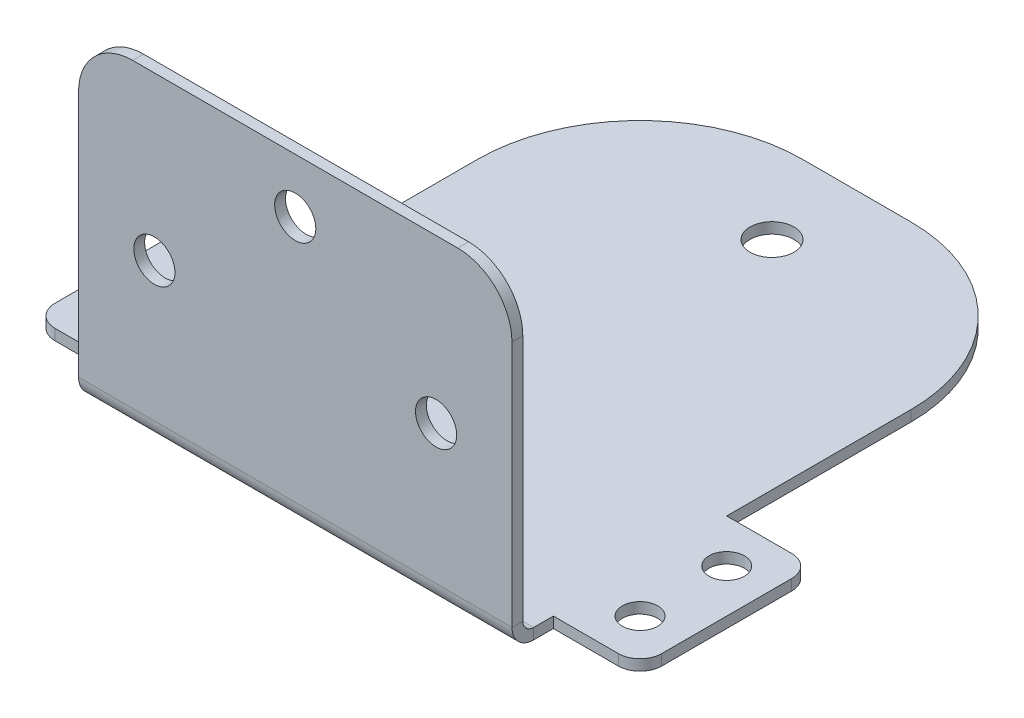
ISO-10303-21;
HEADER;
FILE_DESCRIPTION(('STEP AP214'),'2;1');
FILE_NAME('part.step','',(''),(''),'','','');
FILE_SCHEMA(('AUTOMOTIVE_DESIGN { 1 0 10303 214 1 1 1 1 }'));
ENDSEC;
DATA;
#1=APPLICATION_CONTEXT('core data for automotive mechanical design processes');
#2=APPLICATION_PROTOCOL_DEFINITION('international standard','automotive_design',2000,#1);
#3=PRODUCT_CONTEXT('',#1,'mechanical');
#4=PRODUCT('Part','Part','',(#3));
#5=PRODUCT_RELATED_PRODUCT_CATEGORY('part','',(#4));
#6=PRODUCT_DEFINITION_FORMATION('','',#4);
#7=PRODUCT_DEFINITION_CONTEXT('part definition',#1,'design');
#8=PRODUCT_DEFINITION('design','',#6,#7);
#9=PRODUCT_DEFINITION_SHAPE('','',#8);
#10=(LENGTH_UNIT() NAMED_UNIT(*) SI_UNIT(.MILLI.,.METRE.));
#11=(NAMED_UNIT(*) PLANE_ANGLE_UNIT() SI_UNIT($,.RADIAN.));
#12=(NAMED_UNIT(*) SI_UNIT($,.STERADIAN.) SOLID_ANGLE_UNIT());
#13=UNCERTAINTY_MEASURE_WITH_UNIT(LENGTH_MEASURE(1.E-05),#10,'distance_accuracy_value','');
#14=(GEOMETRIC_REPRESENTATION_CONTEXT(3) GLOBAL_UNCERTAINTY_ASSIGNED_CONTEXT((#13)) GLOBAL_UNIT_ASSIGNED_CONTEXT((#10,
#11,#12)) REPRESENTATION_CONTEXT('',''));
#15=CARTESIAN_POINT('',(0.,0.,0.));
#16=DIRECTION('',(0.,0.,1.));
#17=DIRECTION('',(1.,0.,0.));
#18=AXIS2_PLACEMENT_3D('',#15,#16,#17);
#19=CARTESIAN_POINT('',(5.,-36.1780972450962,11.8219027549039));
#20=DIRECTION('',(0.,0.,1.));
#21=DIRECTION('',(0.,-1.,0.));
#22=AXIS2_PLACEMENT_3D('',#19,#20,#21);
#23=PLANE('',#22);
#24=CARTESIAN_POINT('',(0.,23.8219027549038,11.8219027549037));
#25=DIRECTION('',(0.,0.,-1.));
#26=DIRECTION('',(0.,1.,0.));
#27=AXIS2_PLACEMENT_3D('',#24,#25,#26);
#28=CIRCLE('',#27,1.89864999999999);
#29=CARTESIAN_POINT('',(0.,25.7205527549038,11.8219027549037));
#30=VERTEX_POINT('',#29);
#31=EDGE_CURVE('E463',#30,#30,#28,.T.);
#32=ORIENTED_EDGE('',*,*,#31,.T.);
#33=EDGE_LOOP('',(#32));
#34=FACE_BOUND('',#33,.T.);
#35=DIRECTION('',(0.,1.,0.));
#36=VECTOR('',#35,1.);
#37=CARTESIAN_POINT('',(-20.,-3.17809724509617,11.8219027549038));
#38=LINE('',#37,#36);
#39=CARTESIAN_POINT('',(-20.,1.00000000000001,11.8219027549038));
#40=VERTEX_POINT('',#39);
#41=CARTESIAN_POINT('',(-20.,23.8219027549038,11.8219027549037));
#42=VERTEX_POINT('',#41);
#43=EDGE_CURVE('E47',#40,#42,#38,.T.);
#44=ORIENTED_EDGE('',*,*,#43,.F.);
#45=DIRECTION('',(1.,0.,0.));
#46=VECTOR('',#45,1.);
#47=CARTESIAN_POINT('',(5.,1.,11.8219027549038));
#48=LINE('',#47,#46);
#49=CARTESIAN_POINT('',(20.,1.00000000000001,11.8219027549038));
#50=VERTEX_POINT('',#49);
#51=EDGE_CURVE('E215',#40,#50,#48,.T.);
#52=ORIENTED_EDGE('',*,*,#51,.T.);
#53=DIRECTION('',(0.,-1.,0.));
#54=VECTOR('',#53,1.);
#55=CARTESIAN_POINT('',(20.,-3.17809724509617,11.8219027549038));
#56=LINE('',#55,#54);
#57=CARTESIAN_POINT('',(20.,23.8219027549038,11.8219027549037));
#58=VERTEX_POINT('',#57);
#59=EDGE_CURVE('E245',#58,#50,#56,.T.);
#60=ORIENTED_EDGE('',*,*,#59,.F.);
#61=CARTESIAN_POINT('',(15.,23.8219027549038,11.8219027549037));
#62=DIRECTION('',(0.,0.,-1.));
#63=DIRECTION('',(0.,1.,0.));
#64=AXIS2_PLACEMENT_3D('',#61,#62,#63);
#65=CIRCLE('',#64,5.);
#66=CARTESIAN_POINT('',(15.,28.8219027549038,11.8219027549037));
#67=VERTEX_POINT('',#66);
#68=EDGE_CURVE('E248',#67,#58,#65,.T.);
#69=ORIENTED_EDGE('',*,*,#68,.F.);
#70=DIRECTION('',(1.,0.,0.));
#71=VECTOR('',#70,1.);
#72=CARTESIAN_POINT('',(-15.,28.8219027549038,11.8219027549037));
#73=LINE('',#72,#71);
#74=CARTESIAN_POINT('',(-15.,28.8219027549038,11.8219027549037));
#75=VERTEX_POINT('',#74);
#76=EDGE_CURVE('E403',#75,#67,#73,.T.);
#77=ORIENTED_EDGE('',*,*,#76,.F.);
#78=CARTESIAN_POINT('',(-15.,23.8219027549038,11.8219027549037));
#79=DIRECTION('',(0.,0.,-1.));
#80=DIRECTION('',(0.,1.,0.));
#81=AXIS2_PLACEMENT_3D('',#78,#79,#80);
#82=CIRCLE('',#81,5.);
#83=EDGE_CURVE('E235',#42,#75,#82,.T.);
#84=ORIENTED_EDGE('',*,*,#83,.F.);
#85=EDGE_LOOP('',(#44,#52,#60,#69,#77,#84));
#86=FACE_BOUND('',#85,.T.);
#87=CARTESIAN_POINT('',(13.,13.8219027549038,11.8219027549038));
#88=DIRECTION('',(0.,0.,-1.));
#89=DIRECTION('',(0.,1.,0.));
#90=AXIS2_PLACEMENT_3D('',#87,#88,#89);
#91=CIRCLE('',#90,1.89864999999999);
#92=CARTESIAN_POINT('',(13.,15.7205527549038,11.8219027549038));
#93=VERTEX_POINT('',#92);
#94=EDGE_CURVE('E464',#93,#93,#91,.T.);
#95=ORIENTED_EDGE('',*,*,#94,.T.);
#96=EDGE_LOOP('',(#95));
#97=FACE_BOUND('',#96,.T.);
#98=CARTESIAN_POINT('',(-13.,13.8219027549038,11.8219027549038));
#99=DIRECTION('',(0.,0.,-1.));
#100=DIRECTION('',(0.,1.,0.));
#101=AXIS2_PLACEMENT_3D('',#98,#99,#100);
#102=CIRCLE('',#101,1.89864999999999);
#103=CARTESIAN_POINT('',(-13.,15.7205527549038,11.8219027549038));
#104=VERTEX_POINT('',#103);
#105=EDGE_CURVE('E637',#104,#104,#102,.T.);
#106=ORIENTED_EDGE('',*,*,#105,.T.);
#107=EDGE_LOOP('',(#106));
#108=FACE_BOUND('',#107,.T.);
#109=ADVANCED_FACE('F43',(#34,#86,#97,#108),#23,.T.);
#110=CARTESIAN_POINT('',(20.,-3.17809724509617,11.8219027549038));
#111=DIRECTION('',(1.,0.,0.));
#112=DIRECTION('',(0.,-1.,0.));
#113=AXIS2_PLACEMENT_3D('',#110,#111,#112);
#114=PLANE('',#113);
#115=ORIENTED_EDGE('',*,*,#59,.T.);
#116=DIRECTION('',(0.,0.,-1.));
#117=VECTOR('',#116,1.);
#118=CARTESIAN_POINT('',(20.,1.00000000000001,11.8219027549038));
#119=LINE('',#118,#117);
#120=CARTESIAN_POINT('',(20.,1.00000000000001,10.8219027549038));
#121=VERTEX_POINT('',#120);
#122=EDGE_CURVE('E12',#50,#121,#119,.T.);
#123=ORIENTED_EDGE('',*,*,#122,.T.);
#124=DIRECTION('',(0.,-1.,0.));
#125=VECTOR('',#124,1.);
#126=CARTESIAN_POINT('',(20.,-3.17809724509618,10.8219027549038));
#127=LINE('',#126,#125);
#128=CARTESIAN_POINT('',(20.,23.8219027549038,10.8219027549037));
#129=VERTEX_POINT('',#128);
#130=EDGE_CURVE('E236',#129,#121,#127,.T.);
#131=ORIENTED_EDGE('',*,*,#130,.F.);
#132=DIRECTION('',(0.,0.,-1.));
#133=VECTOR('',#132,1.);
#134=CARTESIAN_POINT('',(20.,23.8219027549038,11.8219027549037));
#135=LINE('',#134,#133);
#136=EDGE_CURVE('E69',#58,#129,#135,.T.);
#137=ORIENTED_EDGE('',*,*,#136,.F.);
#138=EDGE_LOOP('',(#115,#123,#131,#137));
#139=FACE_BOUND('',#138,.T.);
#140=ADVANCED_FACE('F45',(#139),#114,.T.);
#141=CARTESIAN_POINT('',(-20.,-3.17809724509617,11.8219027549038));
#142=DIRECTION('',(-1.,0.,0.));
#143=DIRECTION('',(0.,1.,0.));
#144=AXIS2_PLACEMENT_3D('',#141,#142,#143);
#145=PLANE('',#144);
#146=DIRECTION('',(0.,1.,0.));
#147=VECTOR('',#146,1.);
#148=CARTESIAN_POINT('',(-20.,-3.17809724509617,10.8219027549038));
#149=LINE('',#148,#147);
#150=CARTESIAN_POINT('',(-20.,1.00000000000001,10.8219027549038));
#151=VERTEX_POINT('',#150);
#152=CARTESIAN_POINT('',(-20.,23.8219027549038,10.8219027549037));
#153=VERTEX_POINT('',#152);
#154=EDGE_CURVE('E239',#151,#153,#149,.T.);
#155=ORIENTED_EDGE('',*,*,#154,.F.);
#156=DIRECTION('',(0.,0.,1.));
#157=VECTOR('',#156,1.);
#158=CARTESIAN_POINT('',(-20.,1.00000000000001,11.8219027549038));
#159=LINE('',#158,#157);
#160=EDGE_CURVE('E220',#151,#40,#159,.T.);
#161=ORIENTED_EDGE('',*,*,#160,.T.);
#162=ORIENTED_EDGE('',*,*,#43,.T.);
#163=DIRECTION('',(0.,0.,-1.));
#164=VECTOR('',#163,1.);
#165=CARTESIAN_POINT('',(-20.,23.8219027549038,11.8219027549037));
#166=LINE('',#165,#164);
#167=EDGE_CURVE('E247',#42,#153,#166,.T.);
#168=ORIENTED_EDGE('',*,*,#167,.T.);
#169=EDGE_LOOP('',(#155,#161,#162,#168));
#170=FACE_BOUND('',#169,.T.);
#171=ADVANCED_FACE('F238',(#170),#145,.T.);
#172=CARTESIAN_POINT('',(15.,23.8219027549038,11.8219027549037));
#173=DIRECTION('',(0.,0.,-1.));
#174=DIRECTION('',(0.,1.,0.));
#175=AXIS2_PLACEMENT_3D('',#172,#173,#174);
#176=CYLINDRICAL_SURFACE('',#175,5.);
#177=CARTESIAN_POINT('',(15.,23.8219027549038,10.8219027549037));
#178=DIRECTION('',(0.,0.,-1.));
#179=DIRECTION('',(0.,1.,0.));
#180=AXIS2_PLACEMENT_3D('',#177,#178,#179);
#181=CIRCLE('',#180,5.);
#182=CARTESIAN_POINT('',(15.,28.8219027549038,10.8219027549037));
#183=VERTEX_POINT('',#182);
#184=EDGE_CURVE('E250',#183,#129,#181,.T.);
#185=ORIENTED_EDGE('',*,*,#184,.F.);
#186=DIRECTION('',(0.,0.,-1.));
#187=VECTOR('',#186,1.);
#188=CARTESIAN_POINT('',(15.,28.8219027549038,11.8219027549037));
#189=LINE('',#188,#187);
#190=EDGE_CURVE('E412',#67,#183,#189,.T.);
#191=ORIENTED_EDGE('',*,*,#190,.F.);
#192=ORIENTED_EDGE('',*,*,#68,.T.);
#193=ORIENTED_EDGE('',*,*,#136,.T.);
#194=EDGE_LOOP('',(#185,#191,#192,#193));
#195=FACE_BOUND('',#194,.T.);
#196=ADVANCED_FACE('F423',(#195),#176,.T.);
#197=CARTESIAN_POINT('',(-15.,28.8219027549038,11.8219027549037));
#198=DIRECTION('',(0.,1.,0.));
#199=DIRECTION('',(1.,0.,0.));
#200=AXIS2_PLACEMENT_3D('',#197,#198,#199);
#201=PLANE('',#200);
#202=DIRECTION('',(1.,0.,0.));
#203=VECTOR('',#202,1.);
#204=CARTESIAN_POINT('',(-15.,28.8219027549038,10.8219027549037));
#205=LINE('',#204,#203);
#206=CARTESIAN_POINT('',(-15.,28.8219027549038,10.8219027549037));
#207=VERTEX_POINT('',#206);
#208=EDGE_CURVE('E255',#207,#183,#205,.T.);
#209=ORIENTED_EDGE('',*,*,#208,.F.);
#210=DIRECTION('',(0.,0.,-1.));
#211=VECTOR('',#210,1.);
#212=CARTESIAN_POINT('',(-15.,28.8219027549038,11.8219027549037));
#213=LINE('',#212,#211);
#214=EDGE_CURVE('E414',#75,#207,#213,.T.);
#215=ORIENTED_EDGE('',*,*,#214,.F.);
#216=ORIENTED_EDGE('',*,*,#76,.T.);
#217=ORIENTED_EDGE('',*,*,#190,.T.);
#218=EDGE_LOOP('',(#209,#215,#216,#217));
#219=FACE_BOUND('',#218,.T.);
#220=ADVANCED_FACE('F421',(#219),#201,.T.);
#221=CARTESIAN_POINT('',(-15.,23.8219027549038,11.8219027549037));
#222=DIRECTION('',(0.,0.,-1.));
#223=DIRECTION('',(0.,1.,0.));
#224=AXIS2_PLACEMENT_3D('',#221,#222,#223);
#225=CYLINDRICAL_SURFACE('',#224,5.);
#226=CARTESIAN_POINT('',(-15.,23.8219027549038,10.8219027549037));
#227=DIRECTION('',(0.,0.,-1.));
#228=DIRECTION('',(0.,1.,0.));
#229=AXIS2_PLACEMENT_3D('',#226,#227,#228);
#230=CIRCLE('',#229,5.);
#231=EDGE_CURVE('E251',#153,#207,#230,.T.);
#232=ORIENTED_EDGE('',*,*,#231,.F.);
#233=ORIENTED_EDGE('',*,*,#167,.F.);
#234=ORIENTED_EDGE('',*,*,#83,.T.);
#235=ORIENTED_EDGE('',*,*,#214,.T.);
#236=EDGE_LOOP('',(#232,#233,#234,#235));
#237=FACE_BOUND('',#236,.T.);
#238=ADVANCED_FACE('F417',(#237),#225,.T.);
#239=CARTESIAN_POINT('',(5.,-36.1780972450962,10.8219027549039));
#240=DIRECTION('',(0.,0.,1.));
#241=DIRECTION('',(0.,-1.,0.));
#242=AXIS2_PLACEMENT_3D('',#239,#240,#241);
#243=PLANE('',#242);
#244=CARTESIAN_POINT('',(-13.,13.8219027549038,10.8219027549038));
#245=DIRECTION('',(0.,0.,-1.));
#246=DIRECTION('',(0.,1.,0.));
#247=AXIS2_PLACEMENT_3D('',#244,#245,#246);
#248=CIRCLE('',#247,1.89864999999999);
#249=CARTESIAN_POINT('',(-13.,15.7205527549038,10.8219027549038));
#250=VERTEX_POINT('',#249);
#251=EDGE_CURVE('E454',#250,#250,#248,.T.);
#252=ORIENTED_EDGE('',*,*,#251,.F.);
#253=EDGE_LOOP('',(#252));
#254=FACE_BOUND('',#253,.T.);
#255=CARTESIAN_POINT('',(13.,13.8219027549038,10.8219027549038));
#256=DIRECTION('',(0.,0.,-1.));
#257=DIRECTION('',(0.,1.,0.));
#258=AXIS2_PLACEMENT_3D('',#255,#256,#257);
#259=CIRCLE('',#258,1.89864999999999);
#260=CARTESIAN_POINT('',(13.,15.7205527549038,10.8219027549038));
#261=VERTEX_POINT('',#260);
#262=EDGE_CURVE('E458',#261,#261,#259,.T.);
#263=ORIENTED_EDGE('',*,*,#262,.F.);
#264=EDGE_LOOP('',(#263));
#265=FACE_BOUND('',#264,.T.);
#266=CARTESIAN_POINT('',(0.,23.8219027549038,10.8219027549037));
#267=DIRECTION('',(0.,0.,-1.));
#268=DIRECTION('',(0.,1.,0.));
#269=AXIS2_PLACEMENT_3D('',#266,#267,#268);
#270=CIRCLE('',#269,1.89864999999999);
#271=CARTESIAN_POINT('',(0.,25.7205527549038,10.8219027549037));
#272=VERTEX_POINT('',#271);
#273=EDGE_CURVE('E461',#272,#272,#270,.T.);
#274=ORIENTED_EDGE('',*,*,#273,.F.);
#275=EDGE_LOOP('',(#274));
#276=FACE_BOUND('',#275,.T.);
#277=DIRECTION('',(1.,0.,0.));
#278=VECTOR('',#277,1.);
#279=CARTESIAN_POINT('',(5.,1.,10.8219027549038));
#280=LINE('',#279,#278);
#281=EDGE_CURVE('E52',#151,#121,#280,.T.);
#282=ORIENTED_EDGE('',*,*,#281,.F.);
#283=ORIENTED_EDGE('',*,*,#154,.T.);
#284=ORIENTED_EDGE('',*,*,#231,.T.);
#285=ORIENTED_EDGE('',*,*,#208,.T.);
#286=ORIENTED_EDGE('',*,*,#184,.T.);
#287=ORIENTED_EDGE('',*,*,#130,.T.);
#288=EDGE_LOOP('',(#282,#283,#284,#285,#286,#287));
#289=FACE_BOUND('',#288,.T.);
#290=ADVANCED_FACE('F419',(#254,#265,#276,#289),#243,.F.);
#291=CARTESIAN_POINT('',(20.,-1.,7.99999999999999));
#292=DIRECTION('',(0.,0.,1.));
#293=DIRECTION('',(1.,0.,0.));
#294=AXIS2_PLACEMENT_3D('',#291,#292,#293);
#295=PLANE('',#294);
#296=DIRECTION('',(1.,0.,0.));
#297=VECTOR('',#296,1.);
#298=CARTESIAN_POINT('',(20.,0.,7.99999999999999));
#299=LINE('',#298,#297);
#300=CARTESIAN_POINT('',(20.,0.,7.99999999999999));
#301=VERTEX_POINT('',#300);
#302=CARTESIAN_POINT('',(26.,0.,7.99999999999999));
#303=VERTEX_POINT('',#302);
#304=EDGE_CURVE('E309',#301,#303,#299,.T.);
#305=ORIENTED_EDGE('',*,*,#304,.F.);
#306=DIRECTION('',(0.,1.,0.));
#307=VECTOR('',#306,1.);
#308=CARTESIAN_POINT('',(20.,-1.,7.99999999999999));
#309=LINE('',#308,#307);
#310=CARTESIAN_POINT('',(20.,-1.,7.99999999999999));
#311=VERTEX_POINT('',#310);
#312=EDGE_CURVE('E252',#311,#301,#309,.T.);
#313=ORIENTED_EDGE('',*,*,#312,.F.);
#314=DIRECTION('',(1.,0.,0.));
#315=VECTOR('',#314,1.);
#316=CARTESIAN_POINT('',(20.,-1.,7.99999999999999));
#317=LINE('',#316,#315);
#318=CARTESIAN_POINT('',(26.,-1.,7.99999999999999));
#319=VERTEX_POINT('',#318);
#320=EDGE_CURVE('E393',#311,#319,#317,.T.);
#321=ORIENTED_EDGE('',*,*,#320,.T.);
#322=DIRECTION('',(0.,1.,0.));
#323=VECTOR('',#322,1.);
#324=CARTESIAN_POINT('',(26.,-1.,7.99999999999999));
#325=LINE('',#324,#323);
#326=EDGE_CURVE('E391',#319,#303,#325,.T.);
#327=ORIENTED_EDGE('',*,*,#326,.T.);
#328=EDGE_LOOP('',(#305,#313,#321,#327));
#329=FACE_BOUND('',#328,.T.);
#330=ADVANCED_FACE('F442',(#329),#295,.T.);
#331=CARTESIAN_POINT('',(26.,-1.,5.99999999999999));
#332=DIRECTION('',(0.,1.,0.));
#333=DIRECTION('',(0.,0.,1.));
#334=AXIS2_PLACEMENT_3D('',#331,#332,#333);
#335=CYLINDRICAL_SURFACE('',#334,2.);
#336=CARTESIAN_POINT('',(26.,0.,5.99999999999999));
#337=DIRECTION('',(0.,1.,0.));
#338=DIRECTION('',(0.,0.,1.));
#339=AXIS2_PLACEMENT_3D('',#336,#337,#338);
#340=CIRCLE('',#339,2.);
#341=CARTESIAN_POINT('',(28.,0.,5.99999999999999));
#342=VERTEX_POINT('',#341);
#343=EDGE_CURVE('E306',#303,#342,#340,.T.);
#344=ORIENTED_EDGE('',*,*,#343,.F.);
#345=ORIENTED_EDGE('',*,*,#326,.F.);
#346=CARTESIAN_POINT('',(26.,-1.,5.99999999999999));
#347=DIRECTION('',(0.,1.,0.));
#348=DIRECTION('',(0.,0.,1.));
#349=AXIS2_PLACEMENT_3D('',#346,#347,#348);
#350=CIRCLE('',#349,2.);
#351=CARTESIAN_POINT('',(28.,-1.,5.99999999999999));
#352=VERTEX_POINT('',#351);
#353=EDGE_CURVE('E388',#319,#352,#350,.T.);
#354=ORIENTED_EDGE('',*,*,#353,.T.);
#355=DIRECTION('',(0.,1.,0.));
#356=VECTOR('',#355,1.);
#357=CARTESIAN_POINT('',(28.,-1.,5.99999999999999));
#358=LINE('',#357,#356);
#359=EDGE_CURVE('E386',#352,#342,#358,.T.);
#360=ORIENTED_EDGE('',*,*,#359,.T.);
#361=EDGE_LOOP('',(#344,#345,#354,#360));
#362=FACE_BOUND('',#361,.T.);
#363=ADVANCED_FACE('F448',(#362),#335,.T.);
#364=CARTESIAN_POINT('',(28.,-1.,5.99999999999999));
#365=DIRECTION('',(1.,0.,0.));
#366=DIRECTION('',(0.,0.,-1.));
#367=AXIS2_PLACEMENT_3D('',#364,#365,#366);
#368=PLANE('',#367);
#369=DIRECTION('',(0.,0.,-1.));
#370=VECTOR('',#369,1.);
#371=CARTESIAN_POINT('',(28.,0.,5.99999999999999));
#372=LINE('',#371,#370);
#373=CARTESIAN_POINT('',(28.,0.,-6.00000000000001));
#374=VERTEX_POINT('',#373);
#375=EDGE_CURVE('E303',#342,#374,#372,.T.);
#376=ORIENTED_EDGE('',*,*,#375,.F.);
#377=ORIENTED_EDGE('',*,*,#359,.F.);
#378=DIRECTION('',(0.,0.,-1.));
#379=VECTOR('',#378,1.);
#380=CARTESIAN_POINT('',(28.,-1.,5.99999999999999));
#381=LINE('',#380,#379);
#382=CARTESIAN_POINT('',(28.,-1.,-6.00000000000001));
#383=VERTEX_POINT('',#382);
#384=EDGE_CURVE('E383',#352,#383,#381,.T.);
#385=ORIENTED_EDGE('',*,*,#384,.T.);
#386=DIRECTION('',(0.,1.,0.));
#387=VECTOR('',#386,1.);
#388=CARTESIAN_POINT('',(28.,-1.,-6.00000000000001));
#389=LINE('',#388,#387);
#390=EDGE_CURVE('E381',#383,#374,#389,.T.);
#391=ORIENTED_EDGE('',*,*,#390,.T.);
#392=EDGE_LOOP('',(#376,#377,#385,#391));
#393=FACE_BOUND('',#392,.T.);
#394=ADVANCED_FACE('F561',(#393),#368,.T.);
#395=CARTESIAN_POINT('',(26.,-1.,-6.00000000000001));
#396=DIRECTION('',(0.,1.,0.));
#397=DIRECTION('',(0.,0.,1.));
#398=AXIS2_PLACEMENT_3D('',#395,#396,#397);
#399=CYLINDRICAL_SURFACE('',#398,2.);
#400=CARTESIAN_POINT('',(26.,0.,-6.00000000000001));
#401=DIRECTION('',(0.,1.,0.));
#402=DIRECTION('',(0.,0.,-1.));
#403=AXIS2_PLACEMENT_3D('',#400,#401,#402);
#404=CIRCLE('',#403,2.);
#405=CARTESIAN_POINT('',(26.,0.,-8.00000000000002));
#406=VERTEX_POINT('',#405);
#407=EDGE_CURVE('E300',#374,#406,#404,.T.);
#408=ORIENTED_EDGE('',*,*,#407,.F.);
#409=ORIENTED_EDGE('',*,*,#390,.F.);
#410=CARTESIAN_POINT('',(26.,-1.,-6.00000000000001));
#411=DIRECTION('',(0.,1.,0.));
#412=DIRECTION('',(0.,0.,-1.));
#413=AXIS2_PLACEMENT_3D('',#410,#411,#412);
#414=CIRCLE('',#413,2.);
#415=CARTESIAN_POINT('',(26.,-1.,-8.00000000000002));
#416=VERTEX_POINT('',#415);
#417=EDGE_CURVE('E378',#383,#416,#414,.T.);
#418=ORIENTED_EDGE('',*,*,#417,.T.);
#419=DIRECTION('',(0.,1.,0.));
#420=VECTOR('',#419,1.);
#421=CARTESIAN_POINT('',(26.,-1.,-8.00000000000002));
#422=LINE('',#421,#420);
#423=EDGE_CURVE('E376',#416,#406,#422,.T.);
#424=ORIENTED_EDGE('',*,*,#423,.T.);
#425=EDGE_LOOP('',(#408,#409,#418,#424));
#426=FACE_BOUND('',#425,.T.);
#427=ADVANCED_FACE('F557',(#426),#399,.T.);
#428=CARTESIAN_POINT('',(20.,-1.,-8.00000000000001));
#429=DIRECTION('',(0.,0.,-1.));
#430=DIRECTION('',(-1.,0.,0.));
#431=AXIS2_PLACEMENT_3D('',#428,#429,#430);
#432=PLANE('',#431);
#433=DIRECTION('',(-1.,0.,0.));
#434=VECTOR('',#433,1.);
#435=CARTESIAN_POINT('',(20.,0.,-8.00000000000001));
#436=LINE('',#435,#434);
#437=CARTESIAN_POINT('',(20.,0.,-8.00000000000001));
#438=VERTEX_POINT('',#437);
#439=EDGE_CURVE('E297',#406,#438,#436,.T.);
#440=ORIENTED_EDGE('',*,*,#439,.F.);
#441=ORIENTED_EDGE('',*,*,#423,.F.);
#442=DIRECTION('',(-1.,0.,0.));
#443=VECTOR('',#442,1.);
#444=CARTESIAN_POINT('',(20.,-1.,-8.00000000000001));
#445=LINE('',#444,#443);
#446=CARTESIAN_POINT('',(20.,-1.,-8.00000000000001));
#447=VERTEX_POINT('',#446);
#448=EDGE_CURVE('E373',#416,#447,#445,.T.);
#449=ORIENTED_EDGE('',*,*,#448,.T.);
#450=DIRECTION('',(0.,1.,0.));
#451=VECTOR('',#450,1.);
#452=CARTESIAN_POINT('',(20.,-1.,-8.00000000000001));
#453=LINE('',#452,#451);
#454=EDGE_CURVE('E371',#447,#438,#453,.T.);
#455=ORIENTED_EDGE('',*,*,#454,.T.);
#456=EDGE_LOOP('',(#440,#441,#449,#455));
#457=FACE_BOUND('',#456,.T.);
#458=ADVANCED_FACE('F553',(#457),#432,.T.);
#459=CARTESIAN_POINT('',(20.,-1.,-25.));
#460=DIRECTION('',(1.,0.,0.));
#461=DIRECTION('',(0.,0.,-1.));
#462=AXIS2_PLACEMENT_3D('',#459,#460,#461);
#463=PLANE('',#462);
#464=DIRECTION('',(0.,0.,-1.));
#465=VECTOR('',#464,1.);
#466=CARTESIAN_POINT('',(20.,0.,-25.));
#467=LINE('',#466,#465);
#468=CARTESIAN_POINT('',(20.,0.,-25.));
#469=VERTEX_POINT('',#468);
#470=EDGE_CURVE('E294',#438,#469,#467,.T.);
#471=ORIENTED_EDGE('',*,*,#470,.F.);
#472=ORIENTED_EDGE('',*,*,#454,.F.);
#473=DIRECTION('',(0.,0.,-1.));
#474=VECTOR('',#473,1.);
#475=CARTESIAN_POINT('',(20.,-1.,-25.));
#476=LINE('',#475,#474);
#477=CARTESIAN_POINT('',(20.,-1.,-25.));
#478=VERTEX_POINT('',#477);
#479=EDGE_CURVE('E368',#447,#478,#476,.T.);
#480=ORIENTED_EDGE('',*,*,#479,.T.);
#481=DIRECTION('',(0.,1.,0.));
#482=VECTOR('',#481,1.);
#483=CARTESIAN_POINT('',(20.,-1.,-25.));
#484=LINE('',#483,#482);
#485=EDGE_CURVE('E366',#478,#469,#484,.T.);
#486=ORIENTED_EDGE('',*,*,#485,.T.);
#487=EDGE_LOOP('',(#471,#472,#480,#486));
#488=FACE_BOUND('',#487,.T.);
#489=ADVANCED_FACE('F549',(#488),#463,.T.);
#490=CARTESIAN_POINT('',(5.,-1.,-25.));
#491=DIRECTION('',(0.,1.,0.));
#492=DIRECTION('',(0.,0.,1.));
#493=AXIS2_PLACEMENT_3D('',#490,#491,#492);
#494=CYLINDRICAL_SURFACE('',#493,15.);
#495=CARTESIAN_POINT('',(5.,0.,-25.));
#496=DIRECTION('',(0.,1.,0.));
#497=DIRECTION('',(0.,0.,-1.));
#498=AXIS2_PLACEMENT_3D('',#495,#496,#497);
#499=CIRCLE('',#498,15.);
#500=CARTESIAN_POINT('',(5.,0.,-40.));
#501=VERTEX_POINT('',#500);
#502=EDGE_CURVE('E291',#469,#501,#499,.T.);
#503=ORIENTED_EDGE('',*,*,#502,.F.);
#504=ORIENTED_EDGE('',*,*,#485,.F.);
#505=CARTESIAN_POINT('',(5.,-1.,-25.));
#506=DIRECTION('',(0.,1.,0.));
#507=DIRECTION('',(0.,0.,-1.));
#508=AXIS2_PLACEMENT_3D('',#505,#506,#507);
#509=CIRCLE('',#508,15.);
#510=CARTESIAN_POINT('',(5.,-1.,-40.));
#511=VERTEX_POINT('',#510);
#512=EDGE_CURVE('E363',#478,#511,#509,.T.);
#513=ORIENTED_EDGE('',*,*,#512,.T.);
#514=DIRECTION('',(0.,1.,0.));
#515=VECTOR('',#514,1.);
#516=CARTESIAN_POINT('',(5.,-1.,-40.));
#517=LINE('',#516,#515);
#518=EDGE_CURVE('E361',#511,#501,#517,.T.);
#519=ORIENTED_EDGE('',*,*,#518,.T.);
#520=EDGE_LOOP('',(#503,#504,#513,#519));
#521=FACE_BOUND('',#520,.T.);
#522=ADVANCED_FACE('F545',(#521),#494,.T.);
#523=CARTESIAN_POINT('',(-5.,-1.,-40.));
#524=DIRECTION('',(0.,0.,-1.));
#525=DIRECTION('',(-1.,0.,0.));
#526=AXIS2_PLACEMENT_3D('',#523,#524,#525);
#527=PLANE('',#526);
#528=DIRECTION('',(-1.,0.,0.));
#529=VECTOR('',#528,1.);
#530=CARTESIAN_POINT('',(-5.,0.,-40.));
#531=LINE('',#530,#529);
#532=CARTESIAN_POINT('',(-5.,0.,-40.));
#533=VERTEX_POINT('',#532);
#534=EDGE_CURVE('E288',#501,#533,#531,.T.);
#535=ORIENTED_EDGE('',*,*,#534,.F.);
#536=ORIENTED_EDGE('',*,*,#518,.F.);
#537=DIRECTION('',(-1.,0.,0.));
#538=VECTOR('',#537,1.);
#539=CARTESIAN_POINT('',(-5.,-1.,-40.));
#540=LINE('',#539,#538);
#541=CARTESIAN_POINT('',(-5.,-1.,-40.));
#542=VERTEX_POINT('',#541);
#543=EDGE_CURVE('E358',#511,#542,#540,.T.);
#544=ORIENTED_EDGE('',*,*,#543,.T.);
#545=DIRECTION('',(0.,1.,0.));
#546=VECTOR('',#545,1.);
#547=CARTESIAN_POINT('',(-5.,-1.,-40.));
#548=LINE('',#547,#546);
#549=EDGE_CURVE('E356',#542,#533,#548,.T.);
#550=ORIENTED_EDGE('',*,*,#549,.T.);
#551=EDGE_LOOP('',(#535,#536,#544,#550));
#552=FACE_BOUND('',#551,.T.);
#553=ADVANCED_FACE('F541',(#552),#527,.T.);
#554=CARTESIAN_POINT('',(-5.,-1.,-25.));
#555=DIRECTION('',(0.,1.,0.));
#556=DIRECTION('',(0.,0.,1.));
#557=AXIS2_PLACEMENT_3D('',#554,#555,#556);
#558=CYLINDRICAL_SURFACE('',#557,15.);
#559=CARTESIAN_POINT('',(-5.,0.,-25.));
#560=DIRECTION('',(0.,1.,0.));
#561=DIRECTION('',(0.,0.,1.));
#562=AXIS2_PLACEMENT_3D('',#559,#560,#561);
#563=CIRCLE('',#562,15.);
#564=CARTESIAN_POINT('',(-20.,0.,-25.));
#565=VERTEX_POINT('',#564);
#566=EDGE_CURVE('E285',#533,#565,#563,.T.);
#567=ORIENTED_EDGE('',*,*,#566,.F.);
#568=ORIENTED_EDGE('',*,*,#549,.F.);
#569=CARTESIAN_POINT('',(-5.,-1.,-25.));
#570=DIRECTION('',(0.,1.,0.));
#571=DIRECTION('',(0.,0.,1.));
#572=AXIS2_PLACEMENT_3D('',#569,#570,#571);
#573=CIRCLE('',#572,15.);
#574=CARTESIAN_POINT('',(-20.,-1.,-25.));
#575=VERTEX_POINT('',#574);
#576=EDGE_CURVE('E353',#542,#575,#573,.T.);
#577=ORIENTED_EDGE('',*,*,#576,.T.);
#578=DIRECTION('',(0.,1.,0.));
#579=VECTOR('',#578,1.);
#580=CARTESIAN_POINT('',(-20.,-1.,-25.));
#581=LINE('',#580,#579);
#582=EDGE_CURVE('E351',#575,#565,#581,.T.);
#583=ORIENTED_EDGE('',*,*,#582,.T.);
#584=EDGE_LOOP('',(#567,#568,#577,#583));
#585=FACE_BOUND('',#584,.T.);
#586=ADVANCED_FACE('F537',(#585),#558,.T.);
#587=CARTESIAN_POINT('',(-20.,-1.,-25.));
#588=DIRECTION('',(-1.,0.,0.));
#589=DIRECTION('',(0.,0.,1.));
#590=AXIS2_PLACEMENT_3D('',#587,#588,#589);
#591=PLANE('',#590);
#592=DIRECTION('',(0.,0.,1.));
#593=VECTOR('',#592,1.);
#594=CARTESIAN_POINT('',(-20.,0.,-25.));
#595=LINE('',#594,#593);
#596=CARTESIAN_POINT('',(-20.,0.,-8.00000000000001));
#597=VERTEX_POINT('',#596);
#598=EDGE_CURVE('E282',#565,#597,#595,.T.);
#599=ORIENTED_EDGE('',*,*,#598,.F.);
#600=ORIENTED_EDGE('',*,*,#582,.F.);
#601=DIRECTION('',(0.,0.,1.));
#602=VECTOR('',#601,1.);
#603=CARTESIAN_POINT('',(-20.,-1.,-25.));
#604=LINE('',#603,#602);
#605=CARTESIAN_POINT('',(-20.,-1.,-8.00000000000001));
#606=VERTEX_POINT('',#605);
#607=EDGE_CURVE('E348',#575,#606,#604,.T.);
#608=ORIENTED_EDGE('',*,*,#607,.T.);
#609=DIRECTION('',(0.,1.,0.));
#610=VECTOR('',#609,1.);
#611=CARTESIAN_POINT('',(-20.,-1.,-8.00000000000001));
#612=LINE('',#611,#610);
#613=EDGE_CURVE('E346',#606,#597,#612,.T.);
#614=ORIENTED_EDGE('',*,*,#613,.T.);
#615=EDGE_LOOP('',(#599,#600,#608,#614));
#616=FACE_BOUND('',#615,.T.);
#617=ADVANCED_FACE('F533',(#616),#591,.T.);
#618=CARTESIAN_POINT('',(-20.,-1.,-8.00000000000001));
#619=DIRECTION('',(0.,0.,-1.));
#620=DIRECTION('',(-1.,0.,0.));
#621=AXIS2_PLACEMENT_3D('',#618,#619,#620);
#622=PLANE('',#621);
#623=DIRECTION('',(-1.,0.,0.));
#624=VECTOR('',#623,1.);
#625=CARTESIAN_POINT('',(-20.,0.,-8.00000000000001));
#626=LINE('',#625,#624);
#627=CARTESIAN_POINT('',(-26.,0.,-8.00000000000001));
#628=VERTEX_POINT('',#627);
#629=EDGE_CURVE('E279',#597,#628,#626,.T.);
#630=ORIENTED_EDGE('',*,*,#629,.F.);
#631=ORIENTED_EDGE('',*,*,#613,.F.);
#632=DIRECTION('',(-1.,0.,0.));
#633=VECTOR('',#632,1.);
#634=CARTESIAN_POINT('',(-20.,-1.,-8.00000000000001));
#635=LINE('',#634,#633);
#636=CARTESIAN_POINT('',(-26.,-1.,-8.00000000000001));
#637=VERTEX_POINT('',#636);
#638=EDGE_CURVE('E343',#606,#637,#635,.T.);
#639=ORIENTED_EDGE('',*,*,#638,.T.);
#640=DIRECTION('',(0.,1.,0.));
#641=VECTOR('',#640,1.);
#642=CARTESIAN_POINT('',(-26.,-1.,-8.00000000000001));
#643=LINE('',#642,#641);
#644=EDGE_CURVE('E341',#637,#628,#643,.T.);
#645=ORIENTED_EDGE('',*,*,#644,.T.);
#646=EDGE_LOOP('',(#630,#631,#639,#645));
#647=FACE_BOUND('',#646,.T.);
#648=ADVANCED_FACE('F529',(#647),#622,.T.);
#649=CARTESIAN_POINT('',(-26.,-1.,-6.00000000000001));
#650=DIRECTION('',(0.,1.,0.));
#651=DIRECTION('',(0.,0.,1.));
#652=AXIS2_PLACEMENT_3D('',#649,#650,#651);
#653=CYLINDRICAL_SURFACE('',#652,2.);
#654=CARTESIAN_POINT('',(-26.,0.,-6.00000000000001));
#655=DIRECTION('',(0.,1.,0.));
#656=DIRECTION('',(0.,0.,1.));
#657=AXIS2_PLACEMENT_3D('',#654,#655,#656);
#658=CIRCLE('',#657,2.);
#659=CARTESIAN_POINT('',(-28.,0.,-6.00000000000001));
#660=VERTEX_POINT('',#659);
#661=EDGE_CURVE('E276',#628,#660,#658,.T.);
#662=ORIENTED_EDGE('',*,*,#661,.F.);
#663=ORIENTED_EDGE('',*,*,#644,.F.);
#664=CARTESIAN_POINT('',(-26.,-1.,-6.00000000000001));
#665=DIRECTION('',(0.,1.,0.));
#666=DIRECTION('',(0.,0.,1.));
#667=AXIS2_PLACEMENT_3D('',#664,#665,#666);
#668=CIRCLE('',#667,2.);
#669=CARTESIAN_POINT('',(-28.,-1.,-6.00000000000001));
#670=VERTEX_POINT('',#669);
#671=EDGE_CURVE('E338',#637,#670,#668,.T.);
#672=ORIENTED_EDGE('',*,*,#671,.T.);
#673=DIRECTION('',(0.,1.,0.));
#674=VECTOR('',#673,1.);
#675=CARTESIAN_POINT('',(-28.,-1.,-6.00000000000001));
#676=LINE('',#675,#674);
#677=EDGE_CURVE('E336',#670,#660,#676,.T.);
#678=ORIENTED_EDGE('',*,*,#677,.T.);
#679=EDGE_LOOP('',(#662,#663,#672,#678));
#680=FACE_BOUND('',#679,.T.);
#681=ADVANCED_FACE('F525',(#680),#653,.T.);
#682=CARTESIAN_POINT('',(-28.,-1.,5.99999999999999));
#683=DIRECTION('',(-1.,0.,0.));
#684=DIRECTION('',(0.,0.,1.));
#685=AXIS2_PLACEMENT_3D('',#682,#683,#684);
#686=PLANE('',#685);
#687=DIRECTION('',(0.,0.,1.));
#688=VECTOR('',#687,1.);
#689=CARTESIAN_POINT('',(-28.,0.,5.99999999999999));
#690=LINE('',#689,#688);
#691=CARTESIAN_POINT('',(-28.,0.,5.99999999999999));
#692=VERTEX_POINT('',#691);
#693=EDGE_CURVE('E273',#660,#692,#690,.T.);
#694=ORIENTED_EDGE('',*,*,#693,.F.);
#695=ORIENTED_EDGE('',*,*,#677,.F.);
#696=DIRECTION('',(0.,0.,1.));
#697=VECTOR('',#696,1.);
#698=CARTESIAN_POINT('',(-28.,-1.,5.99999999999999));
#699=LINE('',#698,#697);
#700=CARTESIAN_POINT('',(-28.,-1.,5.99999999999999));
#701=VERTEX_POINT('',#700);
#702=EDGE_CURVE('E333',#670,#701,#699,.T.);
#703=ORIENTED_EDGE('',*,*,#702,.T.);
#704=DIRECTION('',(0.,1.,0.));
#705=VECTOR('',#704,1.);
#706=CARTESIAN_POINT('',(-28.,-1.,5.99999999999999));
#707=LINE('',#706,#705);
#708=EDGE_CURVE('E331',#701,#692,#707,.T.);
#709=ORIENTED_EDGE('',*,*,#708,.T.);
#710=EDGE_LOOP('',(#694,#695,#703,#709));
#711=FACE_BOUND('',#710,.T.);
#712=ADVANCED_FACE('F521',(#711),#686,.T.);
#713=CARTESIAN_POINT('',(-26.,-1.,5.99999999999999));
#714=DIRECTION('',(0.,1.,0.));
#715=DIRECTION('',(0.,0.,1.));
#716=AXIS2_PLACEMENT_3D('',#713,#714,#715);
#717=CYLINDRICAL_SURFACE('',#716,2.);
#718=CARTESIAN_POINT('',(-26.,0.,5.99999999999999));
#719=DIRECTION('',(0.,1.,0.));
#720=DIRECTION('',(0.,0.,-1.));
#721=AXIS2_PLACEMENT_3D('',#718,#719,#720);
#722=CIRCLE('',#721,2.);
#723=CARTESIAN_POINT('',(-26.,0.,7.99999999999999));
#724=VERTEX_POINT('',#723);
#725=EDGE_CURVE('E270',#692,#724,#722,.T.);
#726=ORIENTED_EDGE('',*,*,#725,.F.);
#727=ORIENTED_EDGE('',*,*,#708,.F.);
#728=CARTESIAN_POINT('',(-26.,-1.,5.99999999999999));
#729=DIRECTION('',(0.,1.,0.));
#730=DIRECTION('',(0.,0.,-1.));
#731=AXIS2_PLACEMENT_3D('',#728,#729,#730);
#732=CIRCLE('',#731,2.);
#733=CARTESIAN_POINT('',(-26.,-1.,7.99999999999999));
#734=VERTEX_POINT('',#733);
#735=EDGE_CURVE('E328',#701,#734,#732,.T.);
#736=ORIENTED_EDGE('',*,*,#735,.T.);
#737=DIRECTION('',(0.,1.,0.));
#738=VECTOR('',#737,1.);
#739=CARTESIAN_POINT('',(-26.,-1.,7.99999999999999));
#740=LINE('',#739,#738);
#741=EDGE_CURVE('E326',#734,#724,#740,.T.);
#742=ORIENTED_EDGE('',*,*,#741,.T.);
#743=EDGE_LOOP('',(#726,#727,#736,#742));
#744=FACE_BOUND('',#743,.T.);
#745=ADVANCED_FACE('F517',(#744),#717,.T.);
#746=CARTESIAN_POINT('',(-20.,-1.,7.99999999999999));
#747=DIRECTION('',(0.,0.,1.));
#748=DIRECTION('',(1.,0.,0.));
#749=AXIS2_PLACEMENT_3D('',#746,#747,#748);
#750=PLANE('',#749);
#751=DIRECTION('',(1.,0.,0.));
#752=VECTOR('',#751,1.);
#753=CARTESIAN_POINT('',(-20.,0.,7.99999999999999));
#754=LINE('',#753,#752);
#755=CARTESIAN_POINT('',(-20.,0.,7.99999999999999));
#756=VERTEX_POINT('',#755);
#757=EDGE_CURVE('E263',#724,#756,#754,.T.);
#758=ORIENTED_EDGE('',*,*,#757,.F.);
#759=ORIENTED_EDGE('',*,*,#741,.F.);
#760=DIRECTION('',(1.,0.,0.));
#761=VECTOR('',#760,1.);
#762=CARTESIAN_POINT('',(-20.,-1.,7.99999999999999));
#763=LINE('',#762,#761);
#764=CARTESIAN_POINT('',(-20.,-1.,7.99999999999999));
#765=VERTEX_POINT('',#764);
#766=EDGE_CURVE('E323',#734,#765,#763,.T.);
#767=ORIENTED_EDGE('',*,*,#766,.T.);
#768=DIRECTION('',(0.,1.,0.));
#769=VECTOR('',#768,1.);
#770=CARTESIAN_POINT('',(-20.,-1.,7.99999999999999));
#771=LINE('',#770,#769);
#772=EDGE_CURVE('E321',#765,#756,#771,.T.);
#773=ORIENTED_EDGE('',*,*,#772,.T.);
#774=EDGE_LOOP('',(#758,#759,#767,#773));
#775=FACE_BOUND('',#774,.T.);
#776=ADVANCED_FACE('F513',(#775),#750,.T.);
#777=CARTESIAN_POINT('',(5.,-1.,-25.));
#778=DIRECTION('',(0.,-1.,0.));
#779=DIRECTION('',(0.,0.,-1.));
#780=AXIS2_PLACEMENT_3D('',#777,#778,#779);
#781=PLANE('',#780);
#782=CARTESIAN_POINT('',(-24.,-1.,-4.00000000000001));
#783=DIRECTION('',(0.,1.,0.));
#784=DIRECTION('',(0.,0.,1.));
#785=AXIS2_PLACEMENT_3D('',#782,#783,#784);
#786=CIRCLE('',#785,1.63195);
#787=CARTESIAN_POINT('',(-24.,-1.,-2.36805000000001));
#788=VERTEX_POINT('',#787);
#789=EDGE_CURVE('E611',#788,#788,#786,.T.);
#790=ORIENTED_EDGE('',*,*,#789,.T.);
#791=EDGE_LOOP('',(#790));
#792=FACE_BOUND('',#791,.T.);
#793=CARTESIAN_POINT('',(-24.,-1.,3.99999999999999));
#794=DIRECTION('',(0.,1.,0.));
#795=DIRECTION('',(0.,0.,1.));
#796=AXIS2_PLACEMENT_3D('',#793,#794,#795);
#797=CIRCLE('',#796,1.63195);
#798=CARTESIAN_POINT('',(-24.,-1.,5.63195));
#799=VERTEX_POINT('',#798);
#800=EDGE_CURVE('E621',#799,#799,#797,.T.);
#801=ORIENTED_EDGE('',*,*,#800,.T.);
#802=EDGE_LOOP('',(#801));
#803=FACE_BOUND('',#802,.T.);
#804=CARTESIAN_POINT('',(24.,-1.,-4.00000000000001));
#805=DIRECTION('',(0.,1.,0.));
#806=DIRECTION('',(0.,0.,1.));
#807=AXIS2_PLACEMENT_3D('',#804,#805,#806);
#808=CIRCLE('',#807,1.63195);
#809=CARTESIAN_POINT('',(24.,-1.,-2.36805000000001));
#810=VERTEX_POINT('',#809);
#811=EDGE_CURVE('E627',#810,#810,#808,.T.);
#812=ORIENTED_EDGE('',*,*,#811,.T.);
#813=EDGE_LOOP('',(#812));
#814=FACE_BOUND('',#813,.T.);
#815=CARTESIAN_POINT('',(24.,-1.,3.99999999999999));
#816=DIRECTION('',(0.,1.,0.));
#817=DIRECTION('',(0.,0.,1.));
#818=AXIS2_PLACEMENT_3D('',#815,#816,#817);
#819=CIRCLE('',#818,1.63195);
#820=CARTESIAN_POINT('',(24.,-1.,5.63195));
#821=VERTEX_POINT('',#820);
#822=EDGE_CURVE('E633',#821,#821,#819,.T.);
#823=ORIENTED_EDGE('',*,*,#822,.T.);
#824=EDGE_LOOP('',(#823));
#825=FACE_BOUND('',#824,.T.);
#826=CARTESIAN_POINT('',(0.,-0.999999999999999,-32.1780972450962));
#827=DIRECTION('',(0.,-1.,0.));
#828=DIRECTION('',(0.,0.,-1.));
#829=AXIS2_PLACEMENT_3D('',#826,#827,#828);
#830=CIRCLE('',#829,2.025);
#831=CARTESIAN_POINT('',(0.,-0.999999999999999,-34.2030972450962));
#832=VERTEX_POINT('',#831);
#833=EDGE_CURVE('E474',#832,#832,#830,.T.);
#834=ORIENTED_EDGE('',*,*,#833,.F.);
#835=EDGE_LOOP('',(#834));
#836=FACE_BOUND('',#835,.T.);
#837=DIRECTION('',(1.,0.,0.));
#838=VECTOR('',#837,1.);
#839=CARTESIAN_POINT('',(5.,-1.,9.82190275490381));
#840=LINE('',#839,#838);
#841=CARTESIAN_POINT('',(-20.,-1.,9.82190275490381));
#842=VERTEX_POINT('',#841);
#843=CARTESIAN_POINT('',(20.,-1.,9.82190275490381));
#844=VERTEX_POINT('',#843);
#845=EDGE_CURVE('E400',#842,#844,#840,.T.);
#846=ORIENTED_EDGE('',*,*,#845,.F.);
#847=DIRECTION('',(0.,0.,1.));
#848=VECTOR('',#847,1.);
#849=CARTESIAN_POINT('',(-20.,-1.,7.99999999999999));
#850=LINE('',#849,#848);
#851=EDGE_CURVE('E319',#765,#842,#850,.T.);
#852=ORIENTED_EDGE('',*,*,#851,.F.);
#853=ORIENTED_EDGE('',*,*,#766,.F.);
#854=ORIENTED_EDGE('',*,*,#735,.F.);
#855=ORIENTED_EDGE('',*,*,#702,.F.);
#856=ORIENTED_EDGE('',*,*,#671,.F.);
#857=ORIENTED_EDGE('',*,*,#638,.F.);
#858=ORIENTED_EDGE('',*,*,#607,.F.);
#859=ORIENTED_EDGE('',*,*,#576,.F.);
#860=ORIENTED_EDGE('',*,*,#543,.F.);
#861=ORIENTED_EDGE('',*,*,#512,.F.);
#862=ORIENTED_EDGE('',*,*,#479,.F.);
#863=ORIENTED_EDGE('',*,*,#448,.F.);
#864=ORIENTED_EDGE('',*,*,#417,.F.);
#865=ORIENTED_EDGE('',*,*,#384,.F.);
#866=ORIENTED_EDGE('',*,*,#353,.F.);
#867=ORIENTED_EDGE('',*,*,#320,.F.);
#868=DIRECTION('',(0.,0.,-1.));
#869=VECTOR('',#868,1.);
#870=CARTESIAN_POINT('',(20.,-1.,7.99999999999999));
#871=LINE('',#870,#869);
#872=EDGE_CURVE('E258',#844,#311,#871,.T.);
#873=ORIENTED_EDGE('',*,*,#872,.F.);
#874=EDGE_LOOP('',(#846,#852,#853,#854,#855,#856,#857,#858,#859,#860,#861,#862,#863,#864,#865,
#866,#867,#873));
#875=FACE_BOUND('',#874,.T.);
#876=ADVANCED_FACE('F496',(#792,#803,#814,#825,#836,#875),#781,.T.);
#877=CARTESIAN_POINT('',(-20.,-1.,7.99999999999999));
#878=DIRECTION('',(-1.,0.,0.));
#879=DIRECTION('',(0.,0.,1.));
#880=AXIS2_PLACEMENT_3D('',#877,#878,#879);
#881=PLANE('',#880);
#882=DIRECTION('',(0.,-1.,0.));
#883=VECTOR('',#882,1.);
#884=CARTESIAN_POINT('',(-20.,-1.,9.82190275490382));
#885=LINE('',#884,#883);
#886=CARTESIAN_POINT('',(-20.,0.,9.82190275490381));
#887=VERTEX_POINT('',#886);
#888=EDGE_CURVE('E228',#887,#842,#885,.T.);
#889=ORIENTED_EDGE('',*,*,#888,.F.);
#890=DIRECTION('',(0.,0.,1.));
#891=VECTOR('',#890,1.);
#892=CARTESIAN_POINT('',(-20.,0.,7.99999999999999));
#893=LINE('',#892,#891);
#894=EDGE_CURVE('E317',#756,#887,#893,.T.);
#895=ORIENTED_EDGE('',*,*,#894,.F.);
#896=ORIENTED_EDGE('',*,*,#772,.F.);
#897=ORIENTED_EDGE('',*,*,#851,.T.);
#898=EDGE_LOOP('',(#889,#895,#896,#897));
#899=FACE_BOUND('',#898,.T.);
#900=ADVANCED_FACE('F491',(#899),#881,.T.);
#901=CARTESIAN_POINT('',(5.,0.,-25.));
#902=DIRECTION('',(0.,-1.,0.));
#903=DIRECTION('',(0.,0.,-1.));
#904=AXIS2_PLACEMENT_3D('',#901,#902,#903);
#905=PLANE('',#904);
#906=CARTESIAN_POINT('',(-24.,0.,-4.00000000000001));
#907=DIRECTION('',(0.,1.,0.));
#908=DIRECTION('',(0.,0.,1.));
#909=AXIS2_PLACEMENT_3D('',#906,#907,#908);
#910=CIRCLE('',#909,1.63195);
#911=CARTESIAN_POINT('',(-24.,0.,-2.36805000000001));
#912=VERTEX_POINT('',#911);
#913=EDGE_CURVE('E614',#912,#912,#910,.T.);
#914=ORIENTED_EDGE('',*,*,#913,.F.);
#915=EDGE_LOOP('',(#914));
#916=FACE_BOUND('',#915,.T.);
#917=CARTESIAN_POINT('',(-24.,0.,3.99999999999999));
#918=DIRECTION('',(0.,1.,0.));
#919=DIRECTION('',(0.,0.,1.));
#920=AXIS2_PLACEMENT_3D('',#917,#918,#919);
#921=CIRCLE('',#920,1.63195);
#922=CARTESIAN_POINT('',(-24.,0.,5.63195));
#923=VERTEX_POINT('',#922);
#924=EDGE_CURVE('E616',#923,#923,#921,.T.);
#925=ORIENTED_EDGE('',*,*,#924,.F.);
#926=EDGE_LOOP('',(#925));
#927=FACE_BOUND('',#926,.T.);
#928=CARTESIAN_POINT('',(24.,0.,-4.00000000000001));
#929=DIRECTION('',(0.,1.,0.));
#930=DIRECTION('',(0.,0.,1.));
#931=AXIS2_PLACEMENT_3D('',#928,#929,#930);
#932=CIRCLE('',#931,1.63195);
#933=CARTESIAN_POINT('',(24.,0.,-2.36805000000001));
#934=VERTEX_POINT('',#933);
#935=EDGE_CURVE('E624',#934,#934,#932,.T.);
#936=ORIENTED_EDGE('',*,*,#935,.F.);
#937=EDGE_LOOP('',(#936));
#938=FACE_BOUND('',#937,.T.);
#939=CARTESIAN_POINT('',(24.,0.,3.99999999999999));
#940=DIRECTION('',(0.,1.,0.));
#941=DIRECTION('',(0.,0.,1.));
#942=AXIS2_PLACEMENT_3D('',#939,#940,#941);
#943=CIRCLE('',#942,1.63195);
#944=CARTESIAN_POINT('',(24.,0.,5.63195));
#945=VERTEX_POINT('',#944);
#946=EDGE_CURVE('E630',#945,#945,#943,.T.);
#947=ORIENTED_EDGE('',*,*,#946,.F.);
#948=EDGE_LOOP('',(#947));
#949=FACE_BOUND('',#948,.T.);
#950=CARTESIAN_POINT('',(0.,0.,-32.1780972450962));
#951=DIRECTION('',(0.,1.,0.));
#952=DIRECTION('',(0.,0.,1.));
#953=AXIS2_PLACEMENT_3D('',#950,#951,#952);
#954=CIRCLE('',#953,2.025);
#955=CARTESIAN_POINT('',(0.,0.,-30.1530972450962));
#956=VERTEX_POINT('',#955);
#957=EDGE_CURVE('E466',#956,#956,#954,.T.);
#958=ORIENTED_EDGE('',*,*,#957,.F.);
#959=EDGE_LOOP('',(#958));
#960=FACE_BOUND('',#959,.T.);
#961=ORIENTED_EDGE('',*,*,#894,.T.);
#962=DIRECTION('',(1.,0.,0.));
#963=VECTOR('',#962,1.);
#964=CARTESIAN_POINT('',(5.,0.,9.82190275490381));
#965=LINE('',#964,#963);
#966=CARTESIAN_POINT('',(20.,0.,9.82190275490381));
#967=VERTEX_POINT('',#966);
#968=EDGE_CURVE('E314',#887,#967,#965,.T.);
#969=ORIENTED_EDGE('',*,*,#968,.T.);
#970=DIRECTION('',(0.,0.,-1.));
#971=VECTOR('',#970,1.);
#972=CARTESIAN_POINT('',(20.,0.,7.99999999999999));
#973=LINE('',#972,#971);
#974=EDGE_CURVE('E312',#967,#301,#973,.T.);
#975=ORIENTED_EDGE('',*,*,#974,.T.);
#976=ORIENTED_EDGE('',*,*,#304,.T.);
#977=ORIENTED_EDGE('',*,*,#343,.T.);
#978=ORIENTED_EDGE('',*,*,#375,.T.);
#979=ORIENTED_EDGE('',*,*,#407,.T.);
#980=ORIENTED_EDGE('',*,*,#439,.T.);
#981=ORIENTED_EDGE('',*,*,#470,.T.);
#982=ORIENTED_EDGE('',*,*,#502,.T.);
#983=ORIENTED_EDGE('',*,*,#534,.T.);
#984=ORIENTED_EDGE('',*,*,#566,.T.);
#985=ORIENTED_EDGE('',*,*,#598,.T.);
#986=ORIENTED_EDGE('',*,*,#629,.T.);
#987=ORIENTED_EDGE('',*,*,#661,.T.);
#988=ORIENTED_EDGE('',*,*,#693,.T.);
#989=ORIENTED_EDGE('',*,*,#725,.T.);
#990=ORIENTED_EDGE('',*,*,#757,.T.);
#991=EDGE_LOOP('',(#961,#969,#975,#976,#977,#978,#979,#980,#981,#982,#983,#984,#985,#986,#987,
#988,#989,#990));
#992=FACE_BOUND('',#991,.T.);
#993=ADVANCED_FACE('F487',(#916,#927,#938,#949,#960,#992),#905,.F.);
#994=CARTESIAN_POINT('',(20.,-1.,7.99999999999999));
#995=DIRECTION('',(1.,0.,0.));
#996=DIRECTION('',(0.,0.,-1.));
#997=AXIS2_PLACEMENT_3D('',#994,#995,#996);
#998=PLANE('',#997);
#999=DIRECTION('',(0.,1.,0.));
#1000=VECTOR('',#999,1.);
#1001=CARTESIAN_POINT('',(20.,-1.,9.82190275490382));
#1002=LINE('',#1001,#1000);
#1003=EDGE_CURVE('E397',#844,#967,#1002,.T.);
#1004=ORIENTED_EDGE('',*,*,#1003,.F.);
#1005=ORIENTED_EDGE('',*,*,#872,.T.);
#1006=ORIENTED_EDGE('',*,*,#312,.T.);
#1007=ORIENTED_EDGE('',*,*,#974,.F.);
#1008=EDGE_LOOP('',(#1004,#1005,#1006,#1007));
#1009=FACE_BOUND('',#1008,.T.);
#1010=ADVANCED_FACE('F499',(#1009),#998,.T.);
#1011=CARTESIAN_POINT('',(-20.,1.,9.82190275490381));
#1012=DIRECTION('',(-1.,0.,0.));
#1013=DIRECTION('',(0.,0.,1.));
#1014=AXIS2_PLACEMENT_3D('',#1011,#1012,#1013);
#1015=PLANE('',#1014);
#1016=ORIENTED_EDGE('',*,*,#160,.F.);
#1017=CARTESIAN_POINT('',(-20.,1.,9.82190275490381));
#1018=DIRECTION('',(-1.,0.,0.));
#1019=DIRECTION('',(0.,0.,1.));
#1020=AXIS2_PLACEMENT_3D('',#1017,#1018,#1019);
#1021=CIRCLE('',#1020,1.);
#1022=EDGE_CURVE('E476',#151,#887,#1021,.F.);
#1023=ORIENTED_EDGE('',*,*,#1022,.T.);
#1024=ORIENTED_EDGE('',*,*,#888,.T.);
#1025=CARTESIAN_POINT('',(-20.,1.,9.82190275490381));
#1026=DIRECTION('',(1.,0.,0.));
#1027=DIRECTION('',(0.,0.,1.));
#1028=AXIS2_PLACEMENT_3D('',#1025,#1026,#1027);
#1029=CIRCLE('',#1028,2.);
#1030=EDGE_CURVE('E218',#40,#842,#1029,.T.);
#1031=ORIENTED_EDGE('',*,*,#1030,.F.);
#1032=EDGE_LOOP('',(#1016,#1023,#1024,#1031));
#1033=FACE_BOUND('',#1032,.T.);
#1034=ADVANCED_FACE('F224',(#1033),#1015,.T.);
#1035=CARTESIAN_POINT('',(20.,1.,9.82190275490381));
#1036=DIRECTION('',(1.,0.,0.));
#1037=DIRECTION('',(0.,0.,-1.));
#1038=AXIS2_PLACEMENT_3D('',#1035,#1036,#1037);
#1039=PLANE('',#1038);
#1040=CARTESIAN_POINT('',(20.,1.,9.82190275490381));
#1041=DIRECTION('',(-1.,0.,0.));
#1042=DIRECTION('',(0.,0.,1.));
#1043=AXIS2_PLACEMENT_3D('',#1040,#1041,#1042);
#1044=CIRCLE('',#1043,1.);
#1045=EDGE_CURVE('E229',#967,#121,#1044,.T.);
#1046=ORIENTED_EDGE('',*,*,#1045,.T.);
#1047=ORIENTED_EDGE('',*,*,#122,.F.);
#1048=CARTESIAN_POINT('',(20.,1.,9.82190275490381));
#1049=DIRECTION('',(-1.,0.,0.));
#1050=DIRECTION('',(0.,0.,-1.));
#1051=AXIS2_PLACEMENT_3D('',#1048,#1049,#1050);
#1052=CIRCLE('',#1051,2.);
#1053=EDGE_CURVE('E60',#844,#50,#1052,.T.);
#1054=ORIENTED_EDGE('',*,*,#1053,.F.);
#1055=ORIENTED_EDGE('',*,*,#1003,.T.);
#1056=EDGE_LOOP('',(#1046,#1047,#1054,#1055));
#1057=FACE_BOUND('',#1056,.T.);
#1058=ADVANCED_FACE('F481',(#1057),#1039,.T.);
#1059=CARTESIAN_POINT('',(40.0818119909219,1.,9.82190275490381));
#1060=DIRECTION('',(-1.,0.,0.));
#1061=DIRECTION('',(0.,0.,1.));
#1062=AXIS2_PLACEMENT_3D('',#1059,#1060,#1061);
#1063=CYLINDRICAL_SURFACE('',#1062,2.);
#1064=ORIENTED_EDGE('',*,*,#845,.T.);
#1065=ORIENTED_EDGE('',*,*,#1053,.T.);
#1066=ORIENTED_EDGE('',*,*,#51,.F.);
#1067=ORIENTED_EDGE('',*,*,#1030,.T.);
#1068=EDGE_LOOP('',(#1064,#1065,#1066,#1067));
#1069=FACE_BOUND('',#1068,.T.);
#1070=ADVANCED_FACE('F217',(#1069),#1063,.T.);
#1071=CARTESIAN_POINT('',(40.0818119909219,1.,9.82190275490381));
#1072=DIRECTION('',(-1.,0.,0.));
#1073=DIRECTION('',(0.,0.,1.));
#1074=AXIS2_PLACEMENT_3D('',#1071,#1072,#1073);
#1075=CYLINDRICAL_SURFACE('',#1074,1.);
#1076=ORIENTED_EDGE('',*,*,#968,.F.);
#1077=ORIENTED_EDGE('',*,*,#1022,.F.);
#1078=ORIENTED_EDGE('',*,*,#281,.T.);
#1079=ORIENTED_EDGE('',*,*,#1045,.F.);
#1080=EDGE_LOOP('',(#1076,#1077,#1078,#1079));
#1081=FACE_BOUND('',#1080,.T.);
#1082=ADVANCED_FACE('F485',(#1081),#1075,.F.);
#1083=CARTESIAN_POINT('',(0.,-10.,-32.1780972450962));
#1084=DIRECTION('',(0.,1.,0.));
#1085=DIRECTION('',(0.,0.,1.));
#1086=AXIS2_PLACEMENT_3D('',#1083,#1084,#1085);
#1087=CYLINDRICAL_SURFACE('',#1086,2.025);
#1088=ORIENTED_EDGE('',*,*,#833,.T.);
#1089=EDGE_LOOP('',(#1088));
#1090=FACE_BOUND('',#1089,.T.);
#1091=ORIENTED_EDGE('',*,*,#957,.T.);
#1092=EDGE_LOOP('',(#1091));
#1093=FACE_BOUND('',#1092,.T.);
#1094=ADVANCED_FACE('F573',(#1090,#1093),#1087,.F.);
#1095=CARTESIAN_POINT('',(0.,23.8219027549038,10.8219027549037));
#1096=DIRECTION('',(0.,0.,-1.));
#1097=DIRECTION('',(0.,1.,0.));
#1098=AXIS2_PLACEMENT_3D('',#1095,#1096,#1097);
#1099=CYLINDRICAL_SURFACE('',#1098,1.89864999999999);
#1100=ORIENTED_EDGE('',*,*,#31,.F.);
#1101=EDGE_LOOP('',(#1100));
#1102=FACE_BOUND('',#1101,.T.);
#1103=ORIENTED_EDGE('',*,*,#273,.T.);
#1104=EDGE_LOOP('',(#1103));
#1105=FACE_BOUND('',#1104,.T.);
#1106=ADVANCED_FACE('F578',(#1102,#1105),#1099,.F.);
#1107=CARTESIAN_POINT('',(13.,13.8219027549038,10.8219027549038));
#1108=DIRECTION('',(0.,0.,-1.));
#1109=DIRECTION('',(0.,1.,0.));
#1110=AXIS2_PLACEMENT_3D('',#1107,#1108,#1109);
#1111=CYLINDRICAL_SURFACE('',#1110,1.89864999999999);
#1112=ORIENTED_EDGE('',*,*,#94,.F.);
#1113=EDGE_LOOP('',(#1112));
#1114=FACE_BOUND('',#1113,.T.);
#1115=ORIENTED_EDGE('',*,*,#262,.T.);
#1116=EDGE_LOOP('',(#1115));
#1117=FACE_BOUND('',#1116,.T.);
#1118=ADVANCED_FACE('F582',(#1114,#1117),#1111,.F.);
#1119=CARTESIAN_POINT('',(-13.,13.8219027549038,10.8219027549038));
#1120=DIRECTION('',(0.,0.,-1.));
#1121=DIRECTION('',(0.,1.,0.));
#1122=AXIS2_PLACEMENT_3D('',#1119,#1120,#1121);
#1123=CYLINDRICAL_SURFACE('',#1122,1.89864999999999);
#1124=ORIENTED_EDGE('',*,*,#105,.F.);
#1125=EDGE_LOOP('',(#1124));
#1126=FACE_BOUND('',#1125,.T.);
#1127=ORIENTED_EDGE('',*,*,#251,.T.);
#1128=EDGE_LOOP('',(#1127));
#1129=FACE_BOUND('',#1128,.T.);
#1130=ADVANCED_FACE('F586',(#1126,#1129),#1123,.F.);
#1131=CARTESIAN_POINT('',(24.,0.,3.99999999999999));
#1132=DIRECTION('',(0.,1.,0.));
#1133=DIRECTION('',(0.,0.,1.));
#1134=AXIS2_PLACEMENT_3D('',#1131,#1132,#1133);
#1135=CYLINDRICAL_SURFACE('',#1134,1.63195);
#1136=ORIENTED_EDGE('',*,*,#822,.F.);
#1137=EDGE_LOOP('',(#1136));
#1138=FACE_BOUND('',#1137,.T.);
#1139=ORIENTED_EDGE('',*,*,#946,.T.);
#1140=EDGE_LOOP('',(#1139));
#1141=FACE_BOUND('',#1140,.T.);
#1142=ADVANCED_FACE('F590',(#1138,#1141),#1135,.F.);
#1143=CARTESIAN_POINT('',(24.,0.,-4.00000000000001));
#1144=DIRECTION('',(0.,1.,0.));
#1145=DIRECTION('',(0.,0.,1.));
#1146=AXIS2_PLACEMENT_3D('',#1143,#1144,#1145);
#1147=CYLINDRICAL_SURFACE('',#1146,1.63195);
#1148=ORIENTED_EDGE('',*,*,#811,.F.);
#1149=EDGE_LOOP('',(#1148));
#1150=FACE_BOUND('',#1149,.T.);
#1151=ORIENTED_EDGE('',*,*,#935,.T.);
#1152=EDGE_LOOP('',(#1151));
#1153=FACE_BOUND('',#1152,.T.);
#1154=ADVANCED_FACE('F594',(#1150,#1153),#1147,.F.);
#1155=CARTESIAN_POINT('',(-24.,0.,3.99999999999999));
#1156=DIRECTION('',(0.,1.,0.));
#1157=DIRECTION('',(0.,0.,1.));
#1158=AXIS2_PLACEMENT_3D('',#1155,#1156,#1157);
#1159=CYLINDRICAL_SURFACE('',#1158,1.63195);
#1160=ORIENTED_EDGE('',*,*,#800,.F.);
#1161=EDGE_LOOP('',(#1160));
#1162=FACE_BOUND('',#1161,.T.);
#1163=ORIENTED_EDGE('',*,*,#924,.T.);
#1164=EDGE_LOOP('',(#1163));
#1165=FACE_BOUND('',#1164,.T.);
#1166=ADVANCED_FACE('F598',(#1162,#1165),#1159,.F.);
#1167=CARTESIAN_POINT('',(-24.,0.,-4.00000000000001));
#1168=DIRECTION('',(0.,1.,0.));
#1169=DIRECTION('',(0.,0.,1.));
#1170=AXIS2_PLACEMENT_3D('',#1167,#1168,#1169);
#1171=CYLINDRICAL_SURFACE('',#1170,1.63195);
#1172=ORIENTED_EDGE('',*,*,#789,.F.);
#1173=EDGE_LOOP('',(#1172));
#1174=FACE_BOUND('',#1173,.T.);
#1175=ORIENTED_EDGE('',*,*,#913,.T.);
#1176=EDGE_LOOP('',(#1175));
#1177=FACE_BOUND('',#1176,.T.);
#1178=ADVANCED_FACE('F602',(#1174,#1177),#1171,.F.);
#1179=CLOSED_SHELL('',(#109,#140,#171,#196,#220,#238,#290,#330,#363,#394,#427,#458,#489,#522,
#553,#586,#617,#648,#681,#712,#745,#776,#876,#900,#993,#1010,#1034,#1058,#1070,#1082,#1094,
#1106,#1118,#1130,#1142,#1154,#1166,#1178));
#1180=MANIFOLD_SOLID_BREP('B2',#1179);
#1181=ADVANCED_BREP_SHAPE_REPRESENTATION('',(#18,#1180),#14);
#1182=SHAPE_DEFINITION_REPRESENTATION(#9,#1181);
ENDSEC;
END-ISO-10303-21;
